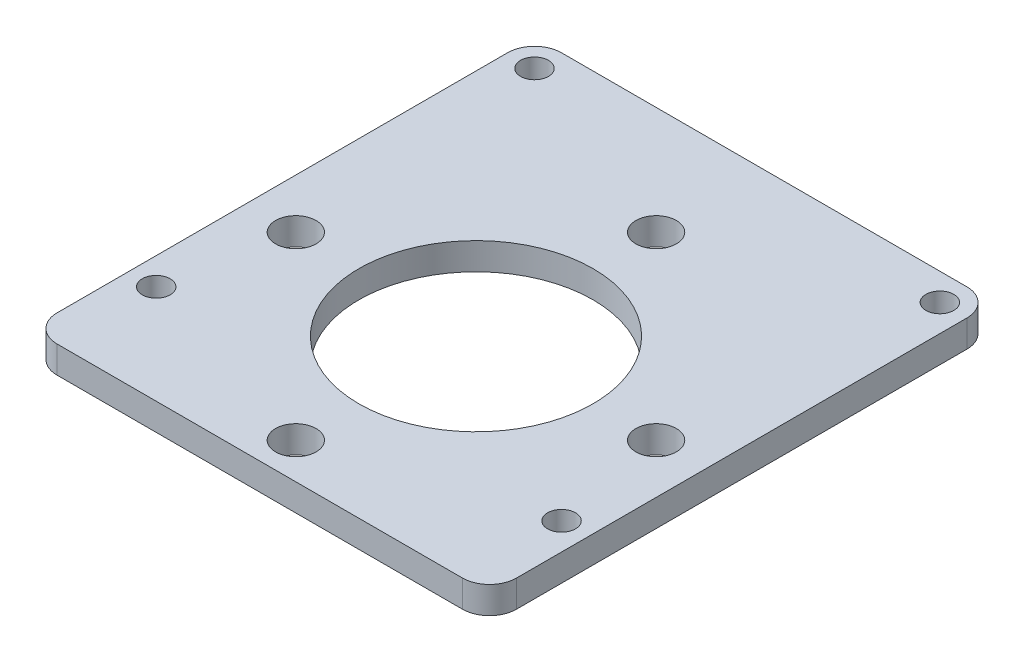
ISO-10303-21;
HEADER;
FILE_DESCRIPTION(('STEP AP214'),'2;1');
FILE_NAME('part.step','',(''),(''),'','','');
FILE_SCHEMA(('AUTOMOTIVE_DESIGN { 1 0 10303 214 1 1 1 1 }'));
ENDSEC;
DATA;
#1=APPLICATION_CONTEXT('core data for automotive mechanical design processes');
#2=APPLICATION_PROTOCOL_DEFINITION('international standard','automotive_design',2000,#1);
#3=PRODUCT_CONTEXT('',#1,'mechanical');
#4=PRODUCT('Part','Part','',(#3));
#5=PRODUCT_RELATED_PRODUCT_CATEGORY('part','',(#4));
#6=PRODUCT_DEFINITION_FORMATION('','',#4);
#7=PRODUCT_DEFINITION_CONTEXT('part definition',#1,'design');
#8=PRODUCT_DEFINITION('design','',#6,#7);
#9=PRODUCT_DEFINITION_SHAPE('','',#8);
#10=(LENGTH_UNIT() NAMED_UNIT(*) SI_UNIT(.MILLI.,.METRE.));
#11=(NAMED_UNIT(*) PLANE_ANGLE_UNIT() SI_UNIT($,.RADIAN.));
#12=(NAMED_UNIT(*) SI_UNIT($,.STERADIAN.) SOLID_ANGLE_UNIT());
#13=UNCERTAINTY_MEASURE_WITH_UNIT(LENGTH_MEASURE(1.E-05),#10,'distance_accuracy_value','');
#14=(GEOMETRIC_REPRESENTATION_CONTEXT(3) GLOBAL_UNCERTAINTY_ASSIGNED_CONTEXT((#13)) GLOBAL_UNIT_ASSIGNED_CONTEXT((#10,
#11,#12)) REPRESENTATION_CONTEXT('',''));
#15=CARTESIAN_POINT('',(0.,0.,0.));
#16=DIRECTION('',(0.,0.,1.));
#17=DIRECTION('',(1.,0.,0.));
#18=AXIS2_PLACEMENT_3D('',#15,#16,#17);
#19=CARTESIAN_POINT('',(25.5,3.,0.));
#20=DIRECTION('',(1.,0.,0.));
#21=DIRECTION('',(0.,0.,-1.));
#22=AXIS2_PLACEMENT_3D('',#19,#20,#21);
#23=PLANE('',#22);
#24=DIRECTION('',(0.,0.,1.));
#25=VECTOR('',#24,1.);
#26=CARTESIAN_POINT('',(25.5,0.,0.));
#27=LINE('',#26,#25);
#28=CARTESIAN_POINT('',(25.5,0.,-21.));
#29=VERTEX_POINT('',#28);
#30=CARTESIAN_POINT('',(25.5,0.,29.));
#31=VERTEX_POINT('',#30);
#32=EDGE_CURVE('E153',#29,#31,#27,.T.);
#33=ORIENTED_EDGE('',*,*,#32,.F.);
#34=DIRECTION('',(0.,-1.,0.));
#35=VECTOR('',#34,1.);
#36=CARTESIAN_POINT('',(25.5,3.,-21.));
#37=LINE('',#36,#35);
#38=CARTESIAN_POINT('',(25.5,3.,-21.));
#39=VERTEX_POINT('',#38);
#40=EDGE_CURVE('E11',#39,#29,#37,.T.);
#41=ORIENTED_EDGE('',*,*,#40,.F.);
#42=DIRECTION('',(0.,0.,1.));
#43=VECTOR('',#42,1.);
#44=CARTESIAN_POINT('',(25.5,3.,0.));
#45=LINE('',#44,#43);
#46=CARTESIAN_POINT('',(25.5,3.,29.));
#47=VERTEX_POINT('',#46);
#48=EDGE_CURVE('E264',#39,#47,#45,.T.);
#49=ORIENTED_EDGE('',*,*,#48,.T.);
#50=DIRECTION('',(0.,-1.,0.));
#51=VECTOR('',#50,1.);
#52=CARTESIAN_POINT('',(25.5,3.,29.));
#53=LINE('',#52,#51);
#54=EDGE_CURVE('E86',#47,#31,#53,.T.);
#55=ORIENTED_EDGE('',*,*,#54,.T.);
#56=EDGE_LOOP('',(#33,#41,#49,#55));
#57=FACE_BOUND('',#56,.T.);
#58=ADVANCED_FACE('F35',(#57),#23,.T.);
#59=CARTESIAN_POINT('',(22.5,3.,-21.));
#60=DIRECTION('',(0.,-1.,0.));
#61=DIRECTION('',(0.,0.,-1.));
#62=AXIS2_PLACEMENT_3D('',#59,#60,#61);
#63=CYLINDRICAL_SURFACE('',#62,3.00000000000001);
#64=CARTESIAN_POINT('',(22.5,0.,-21.));
#65=DIRECTION('',(0.,1.,0.));
#66=DIRECTION('',(0.,0.,1.));
#67=AXIS2_PLACEMENT_3D('',#64,#65,#66);
#68=CIRCLE('',#67,3.00000000000001);
#69=CARTESIAN_POINT('',(22.5,0.,-24.));
#70=VERTEX_POINT('',#69);
#71=EDGE_CURVE('E151',#29,#70,#68,.T.);
#72=ORIENTED_EDGE('',*,*,#71,.T.);
#73=DIRECTION('',(0.,-1.,0.));
#74=VECTOR('',#73,1.);
#75=CARTESIAN_POINT('',(22.5,3.,-24.));
#76=LINE('',#75,#74);
#77=CARTESIAN_POINT('',(22.5,3.,-24.));
#78=VERTEX_POINT('',#77);
#79=EDGE_CURVE('E44',#78,#70,#76,.T.);
#80=ORIENTED_EDGE('',*,*,#79,.F.);
#81=CARTESIAN_POINT('',(22.5,3.,-21.));
#82=DIRECTION('',(0.,1.,0.));
#83=DIRECTION('',(0.,0.,1.));
#84=AXIS2_PLACEMENT_3D('',#81,#82,#83);
#85=CIRCLE('',#84,3.00000000000001);
#86=EDGE_CURVE('E270',#39,#78,#85,.T.);
#87=ORIENTED_EDGE('',*,*,#86,.F.);
#88=ORIENTED_EDGE('',*,*,#40,.T.);
#89=EDGE_LOOP('',(#72,#80,#87,#88));
#90=FACE_BOUND('',#89,.T.);
#91=ADVANCED_FACE('F152',(#90),#63,.T.);
#92=CARTESIAN_POINT('',(0.,3.,-24.));
#93=DIRECTION('',(0.,0.,1.));
#94=DIRECTION('',(1.,0.,0.));
#95=AXIS2_PLACEMENT_3D('',#92,#93,#94);
#96=PLANE('',#95);
#97=DIRECTION('',(-1.,0.,0.));
#98=VECTOR('',#97,1.);
#99=CARTESIAN_POINT('',(0.,0.,-24.));
#100=LINE('',#99,#98);
#101=CARTESIAN_POINT('',(-22.5,0.,-24.));
#102=VERTEX_POINT('',#101);
#103=EDGE_CURVE('E145',#70,#102,#100,.T.);
#104=ORIENTED_EDGE('',*,*,#103,.T.);
#105=DIRECTION('',(0.,-1.,0.));
#106=VECTOR('',#105,1.);
#107=CARTESIAN_POINT('',(-22.5,3.,-24.));
#108=LINE('',#107,#106);
#109=CARTESIAN_POINT('',(-22.5,3.,-24.));
#110=VERTEX_POINT('',#109);
#111=EDGE_CURVE('E136',#110,#102,#108,.T.);
#112=ORIENTED_EDGE('',*,*,#111,.F.);
#113=DIRECTION('',(-1.,0.,0.));
#114=VECTOR('',#113,1.);
#115=CARTESIAN_POINT('',(0.,3.,-24.));
#116=LINE('',#115,#114);
#117=EDGE_CURVE('E147',#78,#110,#116,.T.);
#118=ORIENTED_EDGE('',*,*,#117,.F.);
#119=ORIENTED_EDGE('',*,*,#79,.T.);
#120=EDGE_LOOP('',(#104,#112,#118,#119));
#121=FACE_BOUND('',#120,.T.);
#122=ADVANCED_FACE('F143',(#121),#96,.F.);
#123=CARTESIAN_POINT('',(-22.5,3.,-21.));
#124=DIRECTION('',(0.,-1.,0.));
#125=DIRECTION('',(0.,0.,-1.));
#126=AXIS2_PLACEMENT_3D('',#123,#124,#125);
#127=CYLINDRICAL_SURFACE('',#126,3.00000000000001);
#128=CARTESIAN_POINT('',(-22.5,0.,-21.));
#129=DIRECTION('',(0.,1.,0.));
#130=DIRECTION('',(0.,0.,1.));
#131=AXIS2_PLACEMENT_3D('',#128,#129,#130);
#132=CIRCLE('',#131,3.00000000000001);
#133=CARTESIAN_POINT('',(-25.5,0.,-21.));
#134=VERTEX_POINT('',#133);
#135=EDGE_CURVE('E155',#102,#134,#132,.T.);
#136=ORIENTED_EDGE('',*,*,#135,.T.);
#137=DIRECTION('',(0.,-1.,0.));
#138=VECTOR('',#137,1.);
#139=CARTESIAN_POINT('',(-25.5,3.,-21.));
#140=LINE('',#139,#138);
#141=CARTESIAN_POINT('',(-25.5,3.,-21.));
#142=VERTEX_POINT('',#141);
#143=EDGE_CURVE('E129',#142,#134,#140,.T.);
#144=ORIENTED_EDGE('',*,*,#143,.F.);
#145=CARTESIAN_POINT('',(-22.5,3.,-21.));
#146=DIRECTION('',(0.,1.,0.));
#147=DIRECTION('',(0.,0.,1.));
#148=AXIS2_PLACEMENT_3D('',#145,#146,#147);
#149=CIRCLE('',#148,3.00000000000001);
#150=EDGE_CURVE('E273',#110,#142,#149,.T.);
#151=ORIENTED_EDGE('',*,*,#150,.F.);
#152=ORIENTED_EDGE('',*,*,#111,.T.);
#153=EDGE_LOOP('',(#136,#144,#151,#152));
#154=FACE_BOUND('',#153,.T.);
#155=ADVANCED_FACE('F324',(#154),#127,.T.);
#156=CARTESIAN_POINT('',(-25.5,3.,0.));
#157=DIRECTION('',(1.,0.,0.));
#158=DIRECTION('',(0.,0.,-1.));
#159=AXIS2_PLACEMENT_3D('',#156,#157,#158);
#160=PLANE('',#159);
#161=DIRECTION('',(0.,0.,1.));
#162=VECTOR('',#161,1.);
#163=CARTESIAN_POINT('',(-25.5,0.,0.));
#164=LINE('',#163,#162);
#165=CARTESIAN_POINT('',(-25.5,0.,29.));
#166=VERTEX_POINT('',#165);
#167=EDGE_CURVE('E163',#134,#166,#164,.T.);
#168=ORIENTED_EDGE('',*,*,#167,.T.);
#169=DIRECTION('',(0.,-1.,0.));
#170=VECTOR('',#169,1.);
#171=CARTESIAN_POINT('',(-25.5,3.,29.));
#172=LINE('',#171,#170);
#173=CARTESIAN_POINT('',(-25.5,3.,29.));
#174=VERTEX_POINT('',#173);
#175=EDGE_CURVE('E127',#174,#166,#172,.T.);
#176=ORIENTED_EDGE('',*,*,#175,.F.);
#177=DIRECTION('',(0.,0.,1.));
#178=VECTOR('',#177,1.);
#179=CARTESIAN_POINT('',(-25.5,3.,0.));
#180=LINE('',#179,#178);
#181=EDGE_CURVE('E120',#142,#174,#180,.T.);
#182=ORIENTED_EDGE('',*,*,#181,.F.);
#183=ORIENTED_EDGE('',*,*,#143,.T.);
#184=EDGE_LOOP('',(#168,#176,#182,#183));
#185=FACE_BOUND('',#184,.T.);
#186=ADVANCED_FACE('F321',(#185),#160,.F.);
#187=CARTESIAN_POINT('',(-22.5,3.,29.));
#188=DIRECTION('',(0.,-1.,0.));
#189=DIRECTION('',(0.,0.,-1.));
#190=AXIS2_PLACEMENT_3D('',#187,#188,#189);
#191=CYLINDRICAL_SURFACE('',#190,3.00000000000001);
#192=CARTESIAN_POINT('',(-22.5,0.,29.));
#193=DIRECTION('',(0.,1.,0.));
#194=DIRECTION('',(0.,0.,1.));
#195=AXIS2_PLACEMENT_3D('',#192,#193,#194);
#196=CIRCLE('',#195,3.00000000000001);
#197=CARTESIAN_POINT('',(-22.5,0.,32.));
#198=VERTEX_POINT('',#197);
#199=EDGE_CURVE('E126',#166,#198,#196,.T.);
#200=ORIENTED_EDGE('',*,*,#199,.T.);
#201=DIRECTION('',(0.,-1.,0.));
#202=VECTOR('',#201,1.);
#203=CARTESIAN_POINT('',(-22.5,3.,32.));
#204=LINE('',#203,#202);
#205=CARTESIAN_POINT('',(-22.5,3.,32.));
#206=VERTEX_POINT('',#205);
#207=EDGE_CURVE('E111',#206,#198,#204,.T.);
#208=ORIENTED_EDGE('',*,*,#207,.F.);
#209=CARTESIAN_POINT('',(-22.5,3.,29.));
#210=DIRECTION('',(0.,1.,0.));
#211=DIRECTION('',(0.,0.,1.));
#212=AXIS2_PLACEMENT_3D('',#209,#210,#211);
#213=CIRCLE('',#212,3.00000000000001);
#214=EDGE_CURVE('E114',#174,#206,#213,.T.);
#215=ORIENTED_EDGE('',*,*,#214,.F.);
#216=ORIENTED_EDGE('',*,*,#175,.T.);
#217=EDGE_LOOP('',(#200,#208,#215,#216));
#218=FACE_BOUND('',#217,.T.);
#219=ADVANCED_FACE('F125',(#218),#191,.T.);
#220=CARTESIAN_POINT('',(0.,3.,32.));
#221=DIRECTION('',(0.,0.,-1.));
#222=DIRECTION('',(-1.,0.,0.));
#223=AXIS2_PLACEMENT_3D('',#220,#221,#222);
#224=PLANE('',#223);
#225=DIRECTION('',(1.,0.,0.));
#226=VECTOR('',#225,1.);
#227=CARTESIAN_POINT('',(0.,0.,32.));
#228=LINE('',#227,#226);
#229=CARTESIAN_POINT('',(22.5,0.,32.));
#230=VERTEX_POINT('',#229);
#231=EDGE_CURVE('E167',#198,#230,#228,.T.);
#232=ORIENTED_EDGE('',*,*,#231,.T.);
#233=DIRECTION('',(0.,-1.,0.));
#234=VECTOR('',#233,1.);
#235=CARTESIAN_POINT('',(22.5,3.,32.));
#236=LINE('',#235,#234);
#237=CARTESIAN_POINT('',(22.5,3.,32.));
#238=VERTEX_POINT('',#237);
#239=EDGE_CURVE('E113',#238,#230,#236,.T.);
#240=ORIENTED_EDGE('',*,*,#239,.F.);
#241=DIRECTION('',(1.,0.,0.));
#242=VECTOR('',#241,1.);
#243=CARTESIAN_POINT('',(0.,3.,32.));
#244=LINE('',#243,#242);
#245=EDGE_CURVE('E106',#206,#238,#244,.T.);
#246=ORIENTED_EDGE('',*,*,#245,.F.);
#247=ORIENTED_EDGE('',*,*,#207,.T.);
#248=EDGE_LOOP('',(#232,#240,#246,#247));
#249=FACE_BOUND('',#248,.T.);
#250=ADVANCED_FACE('F109',(#249),#224,.F.);
#251=CARTESIAN_POINT('',(-22.5,3.,-21.));
#252=DIRECTION('',(0.,-1.,0.));
#253=DIRECTION('',(0.,0.,-1.));
#254=AXIS2_PLACEMENT_3D('',#251,#252,#253);
#255=CYLINDRICAL_SURFACE('',#254,1.55);
#256=CARTESIAN_POINT('',(-22.5,3.,-21.));
#257=DIRECTION('',(0.,1.,0.));
#258=DIRECTION('',(0.,0.,1.));
#259=AXIS2_PLACEMENT_3D('',#256,#257,#258);
#260=CIRCLE('',#259,1.55);
#261=CARTESIAN_POINT('',(-22.5,3.,-19.45));
#262=VERTEX_POINT('',#261);
#263=EDGE_CURVE('E190',#262,#262,#260,.T.);
#264=ORIENTED_EDGE('',*,*,#263,.T.);
#265=EDGE_LOOP('',(#264));
#266=FACE_BOUND('',#265,.T.);
#267=CARTESIAN_POINT('',(-22.5,0.,-21.));
#268=DIRECTION('',(0.,1.,0.));
#269=DIRECTION('',(0.,0.,1.));
#270=AXIS2_PLACEMENT_3D('',#267,#268,#269);
#271=CIRCLE('',#270,1.55);
#272=CARTESIAN_POINT('',(-22.5,0.,-19.45));
#273=VERTEX_POINT('',#272);
#274=EDGE_CURVE('E182',#273,#273,#271,.T.);
#275=ORIENTED_EDGE('',*,*,#274,.F.);
#276=EDGE_LOOP('',(#275));
#277=FACE_BOUND('',#276,.T.);
#278=ADVANCED_FACE('F294',(#266,#277),#255,.F.);
#279=CARTESIAN_POINT('',(0.,3.,-12.));
#280=DIRECTION('',(0.,-1.,0.));
#281=DIRECTION('',(0.,0.,-1.));
#282=AXIS2_PLACEMENT_3D('',#279,#280,#281);
#283=CYLINDRICAL_SURFACE('',#282,2.25);
#284=CARTESIAN_POINT('',(0.,3.,-12.));
#285=DIRECTION('',(0.,1.,0.));
#286=DIRECTION('',(0.,0.,1.));
#287=AXIS2_PLACEMENT_3D('',#284,#285,#286);
#288=CIRCLE('',#287,2.25);
#289=CARTESIAN_POINT('',(0.,3.,-9.75000000000001));
#290=VERTEX_POINT('',#289);
#291=EDGE_CURVE('E195',#290,#290,#288,.T.);
#292=ORIENTED_EDGE('',*,*,#291,.T.);
#293=EDGE_LOOP('',(#292));
#294=FACE_BOUND('',#293,.T.);
#295=CARTESIAN_POINT('',(0.,0.,-12.));
#296=DIRECTION('',(0.,1.,0.));
#297=DIRECTION('',(0.,0.,1.));
#298=AXIS2_PLACEMENT_3D('',#295,#296,#297);
#299=CIRCLE('',#298,2.25);
#300=CARTESIAN_POINT('',(0.,0.,-9.75000000000001));
#301=VERTEX_POINT('',#300);
#302=EDGE_CURVE('E179',#301,#301,#299,.T.);
#303=ORIENTED_EDGE('',*,*,#302,.F.);
#304=EDGE_LOOP('',(#303));
#305=FACE_BOUND('',#304,.T.);
#306=ADVANCED_FACE('F288',(#294,#305),#283,.F.);
#307=CARTESIAN_POINT('',(-20.,3.,7.99999999999998));
#308=DIRECTION('',(0.,-1.,0.));
#309=DIRECTION('',(0.,0.,-1.));
#310=AXIS2_PLACEMENT_3D('',#307,#308,#309);
#311=CYLINDRICAL_SURFACE('',#310,2.25);
#312=CARTESIAN_POINT('',(-20.,3.,7.99999999999998));
#313=DIRECTION('',(0.,1.,0.));
#314=DIRECTION('',(0.,0.,1.));
#315=AXIS2_PLACEMENT_3D('',#312,#313,#314);
#316=CIRCLE('',#315,2.25);
#317=CARTESIAN_POINT('',(-20.,3.,10.25));
#318=VERTEX_POINT('',#317);
#319=EDGE_CURVE('E283',#318,#318,#316,.T.);
#320=ORIENTED_EDGE('',*,*,#319,.T.);
#321=EDGE_LOOP('',(#320));
#322=FACE_BOUND('',#321,.T.);
#323=CARTESIAN_POINT('',(-20.,0.,7.99999999999998));
#324=DIRECTION('',(0.,1.,0.));
#325=DIRECTION('',(0.,0.,1.));
#326=AXIS2_PLACEMENT_3D('',#323,#324,#325);
#327=CIRCLE('',#326,2.25);
#328=CARTESIAN_POINT('',(-20.,0.,10.25));
#329=VERTEX_POINT('',#328);
#330=EDGE_CURVE('E176',#329,#329,#327,.T.);
#331=ORIENTED_EDGE('',*,*,#330,.F.);
#332=EDGE_LOOP('',(#331));
#333=FACE_BOUND('',#332,.T.);
#334=ADVANCED_FACE('F301',(#322,#333),#311,.F.);
#335=CARTESIAN_POINT('',(20.,3.,7.99999999999998));
#336=DIRECTION('',(0.,-1.,0.));
#337=DIRECTION('',(0.,0.,-1.));
#338=AXIS2_PLACEMENT_3D('',#335,#336,#337);
#339=CYLINDRICAL_SURFACE('',#338,2.25);
#340=CARTESIAN_POINT('',(20.,3.,7.99999999999998));
#341=DIRECTION('',(0.,1.,0.));
#342=DIRECTION('',(0.,0.,1.));
#343=AXIS2_PLACEMENT_3D('',#340,#341,#342);
#344=CIRCLE('',#343,2.25);
#345=CARTESIAN_POINT('',(20.,3.,10.25));
#346=VERTEX_POINT('',#345);
#347=EDGE_CURVE('E280',#346,#346,#344,.T.);
#348=ORIENTED_EDGE('',*,*,#347,.T.);
#349=EDGE_LOOP('',(#348));
#350=FACE_BOUND('',#349,.T.);
#351=CARTESIAN_POINT('',(20.,0.,7.99999999999998));
#352=DIRECTION('',(0.,1.,0.));
#353=DIRECTION('',(0.,0.,1.));
#354=AXIS2_PLACEMENT_3D('',#351,#352,#353);
#355=CIRCLE('',#354,2.25);
#356=CARTESIAN_POINT('',(20.,0.,10.25));
#357=VERTEX_POINT('',#356);
#358=EDGE_CURVE('E173',#357,#357,#355,.T.);
#359=ORIENTED_EDGE('',*,*,#358,.F.);
#360=EDGE_LOOP('',(#359));
#361=FACE_BOUND('',#360,.T.);
#362=ADVANCED_FACE('F307',(#350,#361),#339,.F.);
#363=CARTESIAN_POINT('',(0.,3.,28.));
#364=DIRECTION('',(0.,-1.,0.));
#365=DIRECTION('',(0.,0.,-1.));
#366=AXIS2_PLACEMENT_3D('',#363,#364,#365);
#367=CYLINDRICAL_SURFACE('',#366,2.25);
#368=CARTESIAN_POINT('',(0.,3.,28.));
#369=DIRECTION('',(0.,1.,0.));
#370=DIRECTION('',(0.,0.,1.));
#371=AXIS2_PLACEMENT_3D('',#368,#369,#370);
#372=CIRCLE('',#371,2.25);
#373=CARTESIAN_POINT('',(0.,3.,30.25));
#374=VERTEX_POINT('',#373);
#375=EDGE_CURVE('E277',#374,#374,#372,.T.);
#376=ORIENTED_EDGE('',*,*,#375,.T.);
#377=EDGE_LOOP('',(#376));
#378=FACE_BOUND('',#377,.T.);
#379=CARTESIAN_POINT('',(0.,0.,28.));
#380=DIRECTION('',(0.,1.,0.));
#381=DIRECTION('',(0.,0.,1.));
#382=AXIS2_PLACEMENT_3D('',#379,#380,#381);
#383=CIRCLE('',#382,2.25);
#384=CARTESIAN_POINT('',(0.,0.,30.25));
#385=VERTEX_POINT('',#384);
#386=EDGE_CURVE('E170',#385,#385,#383,.T.);
#387=ORIENTED_EDGE('',*,*,#386,.F.);
#388=EDGE_LOOP('',(#387));
#389=FACE_BOUND('',#388,.T.);
#390=ADVANCED_FACE('F311',(#378,#389),#367,.F.);
#391=CARTESIAN_POINT('',(22.5,3.,29.));
#392=DIRECTION('',(0.,-1.,0.));
#393=DIRECTION('',(0.,0.,-1.));
#394=AXIS2_PLACEMENT_3D('',#391,#392,#393);
#395=CYLINDRICAL_SURFACE('',#394,3.00000000000001);
#396=CARTESIAN_POINT('',(22.5,0.,29.));
#397=DIRECTION('',(0.,1.,0.));
#398=DIRECTION('',(0.,0.,1.));
#399=AXIS2_PLACEMENT_3D('',#396,#397,#398);
#400=CIRCLE('',#399,3.00000000000001);
#401=EDGE_CURVE('E79',#230,#31,#400,.T.);
#402=ORIENTED_EDGE('',*,*,#401,.T.);
#403=ORIENTED_EDGE('',*,*,#54,.F.);
#404=CARTESIAN_POINT('',(22.5,3.,29.));
#405=DIRECTION('',(0.,1.,0.));
#406=DIRECTION('',(0.,0.,1.));
#407=AXIS2_PLACEMENT_3D('',#404,#405,#406);
#408=CIRCLE('',#407,3.00000000000001);
#409=EDGE_CURVE('E52',#238,#47,#408,.T.);
#410=ORIENTED_EDGE('',*,*,#409,.F.);
#411=ORIENTED_EDGE('',*,*,#239,.T.);
#412=EDGE_LOOP('',(#402,#403,#410,#411));
#413=FACE_BOUND('',#412,.T.);
#414=ADVANCED_FACE('F248',(#413),#395,.T.);
#415=CARTESIAN_POINT('',(-22.5,3.,21.));
#416=DIRECTION('',(0.,-1.,0.));
#417=DIRECTION('',(0.,0.,-1.));
#418=AXIS2_PLACEMENT_3D('',#415,#416,#417);
#419=CYLINDRICAL_SURFACE('',#418,1.55);
#420=CARTESIAN_POINT('',(-22.5,3.,21.));
#421=DIRECTION('',(0.,1.,0.));
#422=DIRECTION('',(0.,0.,1.));
#423=AXIS2_PLACEMENT_3D('',#420,#421,#422);
#424=CIRCLE('',#423,1.55);
#425=CARTESIAN_POINT('',(-22.5,3.,22.55));
#426=VERTEX_POINT('',#425);
#427=EDGE_CURVE('E261',#426,#426,#424,.F.);
#428=ORIENTED_EDGE('',*,*,#427,.F.);
#429=EDGE_LOOP('',(#428));
#430=FACE_BOUND('',#429,.T.);
#431=CARTESIAN_POINT('',(-22.5,0.,21.));
#432=DIRECTION('',(0.,1.,0.));
#433=DIRECTION('',(0.,0.,1.));
#434=AXIS2_PLACEMENT_3D('',#431,#432,#433);
#435=CIRCLE('',#434,1.55);
#436=CARTESIAN_POINT('',(-22.5,0.,22.55));
#437=VERTEX_POINT('',#436);
#438=EDGE_CURVE('E157',#437,#437,#435,.F.);
#439=ORIENTED_EDGE('',*,*,#438,.T.);
#440=EDGE_LOOP('',(#439));
#441=FACE_BOUND('',#440,.T.);
#442=ADVANCED_FACE('F207',(#430,#441),#419,.F.);
#443=CARTESIAN_POINT('',(22.5,3.,21.));
#444=DIRECTION('',(0.,-1.,0.));
#445=DIRECTION('',(0.,0.,-1.));
#446=AXIS2_PLACEMENT_3D('',#443,#444,#445);
#447=CYLINDRICAL_SURFACE('',#446,1.55);
#448=CARTESIAN_POINT('',(22.5,3.,21.));
#449=DIRECTION('',(0.,1.,0.));
#450=DIRECTION('',(0.,0.,1.));
#451=AXIS2_PLACEMENT_3D('',#448,#449,#450);
#452=CIRCLE('',#451,1.55);
#453=CARTESIAN_POINT('',(22.5,3.,22.55));
#454=VERTEX_POINT('',#453);
#455=EDGE_CURVE('E257',#454,#454,#452,.T.);
#456=ORIENTED_EDGE('',*,*,#455,.T.);
#457=EDGE_LOOP('',(#456));
#458=FACE_BOUND('',#457,.T.);
#459=CARTESIAN_POINT('',(22.5,0.,21.));
#460=DIRECTION('',(0.,1.,0.));
#461=DIRECTION('',(0.,0.,1.));
#462=AXIS2_PLACEMENT_3D('',#459,#460,#461);
#463=CIRCLE('',#462,1.55);
#464=CARTESIAN_POINT('',(22.5,0.,22.55));
#465=VERTEX_POINT('',#464);
#466=EDGE_CURVE('E202',#465,#465,#463,.T.);
#467=ORIENTED_EDGE('',*,*,#466,.F.);
#468=EDGE_LOOP('',(#467));
#469=FACE_BOUND('',#468,.T.);
#470=ADVANCED_FACE('F236',(#458,#469),#447,.F.);
#471=CARTESIAN_POINT('',(0.,3.,7.99999999999999));
#472=DIRECTION('',(0.,-1.,0.));
#473=DIRECTION('',(0.,0.,-1.));
#474=AXIS2_PLACEMENT_3D('',#471,#472,#473);
#475=CYLINDRICAL_SURFACE('',#474,13.);
#476=CARTESIAN_POINT('',(0.,3.,7.99999999999999));
#477=DIRECTION('',(0.,1.,0.));
#478=DIRECTION('',(0.,0.,1.));
#479=AXIS2_PLACEMENT_3D('',#476,#477,#478);
#480=CIRCLE('',#479,13.);
#481=CARTESIAN_POINT('',(0.,3.,21.));
#482=VERTEX_POINT('',#481);
#483=EDGE_CURVE('E187',#482,#482,#480,.T.);
#484=ORIENTED_EDGE('',*,*,#483,.T.);
#485=EDGE_LOOP('',(#484));
#486=FACE_BOUND('',#485,.T.);
#487=CARTESIAN_POINT('',(0.,0.,7.99999999999999));
#488=DIRECTION('',(0.,1.,0.));
#489=DIRECTION('',(0.,0.,1.));
#490=AXIS2_PLACEMENT_3D('',#487,#488,#489);
#491=CIRCLE('',#490,13.);
#492=CARTESIAN_POINT('',(0.,0.,21.));
#493=VERTEX_POINT('',#492);
#494=EDGE_CURVE('E199',#493,#493,#491,.T.);
#495=ORIENTED_EDGE('',*,*,#494,.F.);
#496=EDGE_LOOP('',(#495));
#497=FACE_BOUND('',#496,.T.);
#498=ADVANCED_FACE('F37',(#486,#497),#475,.F.);
#499=CARTESIAN_POINT('',(22.5,3.,-21.));
#500=DIRECTION('',(0.,-1.,0.));
#501=DIRECTION('',(0.,0.,-1.));
#502=AXIS2_PLACEMENT_3D('',#499,#500,#501);
#503=CYLINDRICAL_SURFACE('',#502,1.55);
#504=CARTESIAN_POINT('',(22.5,3.,-21.));
#505=DIRECTION('',(0.,1.,0.));
#506=DIRECTION('',(0.,0.,1.));
#507=AXIS2_PLACEMENT_3D('',#504,#505,#506);
#508=CIRCLE('',#507,1.55);
#509=CARTESIAN_POINT('',(22.5,3.,-19.45));
#510=VERTEX_POINT('',#509);
#511=EDGE_CURVE('E188',#510,#510,#508,.F.);
#512=ORIENTED_EDGE('',*,*,#511,.F.);
#513=EDGE_LOOP('',(#512));
#514=FACE_BOUND('',#513,.T.);
#515=CARTESIAN_POINT('',(22.5,0.,-21.));
#516=DIRECTION('',(0.,1.,0.));
#517=DIRECTION('',(0.,0.,1.));
#518=AXIS2_PLACEMENT_3D('',#515,#516,#517);
#519=CIRCLE('',#518,1.55);
#520=CARTESIAN_POINT('',(22.5,0.,-19.45));
#521=VERTEX_POINT('',#520);
#522=EDGE_CURVE('E185',#521,#521,#519,.F.);
#523=ORIENTED_EDGE('',*,*,#522,.T.);
#524=EDGE_LOOP('',(#523));
#525=FACE_BOUND('',#524,.T.);
#526=ADVANCED_FACE('F226',(#514,#525),#503,.F.);
#527=CARTESIAN_POINT('',(0.,3.,0.));
#528=DIRECTION('',(0.,1.,0.));
#529=DIRECTION('',(0.,0.,1.));
#530=AXIS2_PLACEMENT_3D('',#527,#528,#529);
#531=PLANE('',#530);
#532=ORIENTED_EDGE('',*,*,#483,.F.);
#533=EDGE_LOOP('',(#532));
#534=FACE_BOUND('',#533,.T.);
#535=ORIENTED_EDGE('',*,*,#455,.F.);
#536=EDGE_LOOP('',(#535));
#537=FACE_BOUND('',#536,.T.);
#538=ORIENTED_EDGE('',*,*,#427,.T.);
#539=EDGE_LOOP('',(#538));
#540=FACE_BOUND('',#539,.T.);
#541=ORIENTED_EDGE('',*,*,#48,.F.);
#542=ORIENTED_EDGE('',*,*,#86,.T.);
#543=ORIENTED_EDGE('',*,*,#117,.T.);
#544=ORIENTED_EDGE('',*,*,#150,.T.);
#545=ORIENTED_EDGE('',*,*,#181,.T.);
#546=ORIENTED_EDGE('',*,*,#214,.T.);
#547=ORIENTED_EDGE('',*,*,#245,.T.);
#548=ORIENTED_EDGE('',*,*,#409,.T.);
#549=EDGE_LOOP('',(#541,#542,#543,#544,#545,#546,#547,#548));
#550=FACE_BOUND('',#549,.T.);
#551=ORIENTED_EDGE('',*,*,#375,.F.);
#552=EDGE_LOOP('',(#551));
#553=FACE_BOUND('',#552,.T.);
#554=ORIENTED_EDGE('',*,*,#347,.F.);
#555=EDGE_LOOP('',(#554));
#556=FACE_BOUND('',#555,.T.);
#557=ORIENTED_EDGE('',*,*,#319,.F.);
#558=EDGE_LOOP('',(#557));
#559=FACE_BOUND('',#558,.T.);
#560=ORIENTED_EDGE('',*,*,#291,.F.);
#561=EDGE_LOOP('',(#560));
#562=FACE_BOUND('',#561,.T.);
#563=ORIENTED_EDGE('',*,*,#263,.F.);
#564=EDGE_LOOP('',(#563));
#565=FACE_BOUND('',#564,.T.);
#566=ORIENTED_EDGE('',*,*,#511,.T.);
#567=EDGE_LOOP('',(#566));
#568=FACE_BOUND('',#567,.T.);
#569=ADVANCED_FACE('F117',(#534,#537,#540,#550,#553,#556,#559,#562,#565,#568),#531,.T.);
#570=CARTESIAN_POINT('',(0.,0.,0.));
#571=DIRECTION('',(0.,1.,0.));
#572=DIRECTION('',(0.,0.,1.));
#573=AXIS2_PLACEMENT_3D('',#570,#571,#572);
#574=PLANE('',#573);
#575=ORIENTED_EDGE('',*,*,#494,.T.);
#576=EDGE_LOOP('',(#575));
#577=FACE_BOUND('',#576,.T.);
#578=ORIENTED_EDGE('',*,*,#466,.T.);
#579=EDGE_LOOP('',(#578));
#580=FACE_BOUND('',#579,.T.);
#581=ORIENTED_EDGE('',*,*,#438,.F.);
#582=EDGE_LOOP('',(#581));
#583=FACE_BOUND('',#582,.T.);
#584=ORIENTED_EDGE('',*,*,#32,.T.);
#585=ORIENTED_EDGE('',*,*,#401,.F.);
#586=ORIENTED_EDGE('',*,*,#231,.F.);
#587=ORIENTED_EDGE('',*,*,#199,.F.);
#588=ORIENTED_EDGE('',*,*,#167,.F.);
#589=ORIENTED_EDGE('',*,*,#135,.F.);
#590=ORIENTED_EDGE('',*,*,#103,.F.);
#591=ORIENTED_EDGE('',*,*,#71,.F.);
#592=EDGE_LOOP('',(#584,#585,#586,#587,#588,#589,#590,#591));
#593=FACE_BOUND('',#592,.T.);
#594=ORIENTED_EDGE('',*,*,#386,.T.);
#595=EDGE_LOOP('',(#594));
#596=FACE_BOUND('',#595,.T.);
#597=ORIENTED_EDGE('',*,*,#358,.T.);
#598=EDGE_LOOP('',(#597));
#599=FACE_BOUND('',#598,.T.);
#600=ORIENTED_EDGE('',*,*,#330,.T.);
#601=EDGE_LOOP('',(#600));
#602=FACE_BOUND('',#601,.T.);
#603=ORIENTED_EDGE('',*,*,#302,.T.);
#604=EDGE_LOOP('',(#603));
#605=FACE_BOUND('',#604,.T.);
#606=ORIENTED_EDGE('',*,*,#274,.T.);
#607=EDGE_LOOP('',(#606));
#608=FACE_BOUND('',#607,.T.);
#609=ORIENTED_EDGE('',*,*,#522,.F.);
#610=EDGE_LOOP('',(#609));
#611=FACE_BOUND('',#610,.T.);
#612=ADVANCED_FACE('F209',(#577,#580,#583,#593,#596,#599,#602,#605,#608,#611),#574,.F.);
#613=CLOSED_SHELL('',(#58,#91,#122,#155,#186,#219,#250,#278,#306,#334,#362,#390,#414,#442,#470,
#498,#526,#569,#612));
#614=MANIFOLD_SOLID_BREP('B2',#613);
#615=ADVANCED_BREP_SHAPE_REPRESENTATION('',(#18,#614),#14);
#616=SHAPE_DEFINITION_REPRESENTATION(#9,#615);
ENDSEC;
END-ISO-10303-21;
